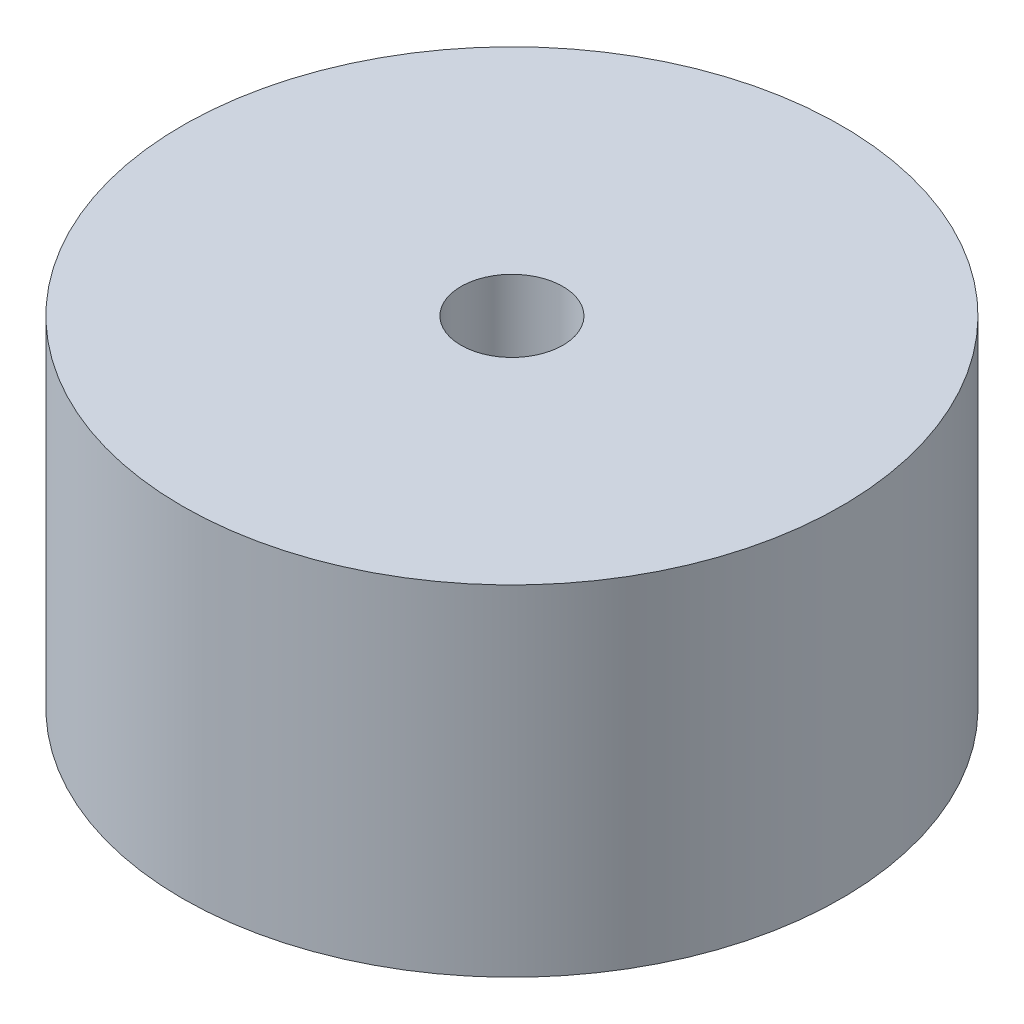
ISO-10303-21;
HEADER;
FILE_DESCRIPTION(('STEP AP214'),'2;1');
FILE_NAME('part.step','',(''),(''),'','','');
FILE_SCHEMA(('AUTOMOTIVE_DESIGN { 1 0 10303 214 1 1 1 1 }'));
ENDSEC;
DATA;
#1=APPLICATION_CONTEXT('core data for automotive mechanical design processes');
#2=APPLICATION_PROTOCOL_DEFINITION('international standard','automotive_design',2000,#1);
#3=PRODUCT_CONTEXT('',#1,'mechanical');
#4=PRODUCT('Part','Part','',(#3));
#5=PRODUCT_RELATED_PRODUCT_CATEGORY('part','',(#4));
#6=PRODUCT_DEFINITION_FORMATION('','',#4);
#7=PRODUCT_DEFINITION_CONTEXT('part definition',#1,'design');
#8=PRODUCT_DEFINITION('design','',#6,#7);
#9=PRODUCT_DEFINITION_SHAPE('','',#8);
#10=(LENGTH_UNIT() NAMED_UNIT(*) SI_UNIT(.MILLI.,.METRE.));
#11=(NAMED_UNIT(*) PLANE_ANGLE_UNIT() SI_UNIT($,.RADIAN.));
#12=(NAMED_UNIT(*) SI_UNIT($,.STERADIAN.) SOLID_ANGLE_UNIT());
#13=UNCERTAINTY_MEASURE_WITH_UNIT(LENGTH_MEASURE(1.E-05),#10,'distance_accuracy_value','');
#14=(GEOMETRIC_REPRESENTATION_CONTEXT(3) GLOBAL_UNCERTAINTY_ASSIGNED_CONTEXT((#13)) GLOBAL_UNIT_ASSIGNED_CONTEXT((#10,
#11,#12)) REPRESENTATION_CONTEXT('',''));
#15=CARTESIAN_POINT('',(0.,0.,0.));
#16=DIRECTION('',(0.,0.,1.));
#17=DIRECTION('',(1.,0.,0.));
#18=AXIS2_PLACEMENT_3D('',#15,#16,#17);
#19=CARTESIAN_POINT('',(0.,50.,0.));
#20=DIRECTION('',(0.,-1.,0.));
#21=DIRECTION('',(0.,0.,-1.));
#22=AXIS2_PLACEMENT_3D('',#19,#20,#21);
#23=CYLINDRICAL_SURFACE('',#22,48.5);
#24=CARTESIAN_POINT('',(0.,50.,0.));
#25=DIRECTION('',(0.,1.,0.));
#26=DIRECTION('',(0.,0.,1.));
#27=AXIS2_PLACEMENT_3D('',#24,#25,#26);
#28=CIRCLE('',#27,48.5);
#29=CARTESIAN_POINT('',(0.,50.,48.5));
#30=VERTEX_POINT('',#29);
#31=EDGE_CURVE('E10',#30,#30,#28,.T.);
#32=ORIENTED_EDGE('',*,*,#31,.F.);
#33=EDGE_LOOP('',(#32));
#34=FACE_BOUND('',#33,.T.);
#35=CARTESIAN_POINT('',(0.,0.,0.));
#36=DIRECTION('',(0.,1.,0.));
#37=DIRECTION('',(0.,0.,1.));
#38=AXIS2_PLACEMENT_3D('',#35,#36,#37);
#39=CIRCLE('',#38,48.5);
#40=CARTESIAN_POINT('',(0.,0.,48.5));
#41=VERTEX_POINT('',#40);
#42=EDGE_CURVE('E37',#41,#41,#39,.T.);
#43=ORIENTED_EDGE('',*,*,#42,.T.);
#44=EDGE_LOOP('',(#43));
#45=FACE_BOUND('',#44,.T.);
#46=ADVANCED_FACE('F40',(#34,#45),#23,.T.);
#47=CARTESIAN_POINT('',(0.,50.,0.));
#48=DIRECTION('',(0.,1.,0.));
#49=DIRECTION('',(0.,0.,1.));
#50=AXIS2_PLACEMENT_3D('',#47,#48,#49);
#51=PLANE('',#50);
#52=CARTESIAN_POINT('',(0.,50.,0.));
#53=DIRECTION('',(0.,1.,0.));
#54=DIRECTION('',(0.,0.,1.));
#55=AXIS2_PLACEMENT_3D('',#52,#53,#54);
#56=CIRCLE('',#55,7.5);
#57=CARTESIAN_POINT('',(0.,50.,7.5));
#58=VERTEX_POINT('',#57);
#59=EDGE_CURVE('E47',#58,#58,#56,.T.);
#60=ORIENTED_EDGE('',*,*,#59,.F.);
#61=EDGE_LOOP('',(#60));
#62=FACE_BOUND('',#61,.T.);
#63=ORIENTED_EDGE('',*,*,#31,.T.);
#64=EDGE_LOOP('',(#63));
#65=FACE_BOUND('',#64,.T.);
#66=ADVANCED_FACE('F62',(#62,#65),#51,.T.);
#67=CARTESIAN_POINT('',(0.,0.,0.));
#68=DIRECTION('',(0.,1.,0.));
#69=DIRECTION('',(0.,0.,1.));
#70=AXIS2_PLACEMENT_3D('',#67,#68,#69);
#71=PLANE('',#70);
#72=ORIENTED_EDGE('',*,*,#42,.F.);
#73=EDGE_LOOP('',(#72));
#74=FACE_BOUND('',#73,.T.);
#75=ADVANCED_FACE('F58',(#74),#71,.F.);
#76=CARTESIAN_POINT('',(0.,20.,0.));
#77=DIRECTION('',(0.,1.,0.));
#78=DIRECTION('',(0.,0.,1.));
#79=AXIS2_PLACEMENT_3D('',#76,#77,#78);
#80=CYLINDRICAL_SURFACE('',#79,7.5);
#81=CARTESIAN_POINT('',(0.,20.,0.));
#82=DIRECTION('',(0.,1.,0.));
#83=DIRECTION('',(0.,0.,1.));
#84=AXIS2_PLACEMENT_3D('',#81,#82,#83);
#85=CIRCLE('',#84,7.5);
#86=CARTESIAN_POINT('',(0.,20.,7.5));
#87=VERTEX_POINT('',#86);
#88=EDGE_CURVE('E50',#87,#87,#85,.T.);
#89=ORIENTED_EDGE('',*,*,#88,.F.);
#90=EDGE_LOOP('',(#89));
#91=FACE_BOUND('',#90,.T.);
#92=ORIENTED_EDGE('',*,*,#59,.T.);
#93=EDGE_LOOP('',(#92));
#94=FACE_BOUND('',#93,.T.);
#95=ADVANCED_FACE('F60',(#91,#94),#80,.F.);
#96=CARTESIAN_POINT('',(0.,20.,0.));
#97=DIRECTION('',(0.,1.,0.));
#98=DIRECTION('',(0.,0.,1.));
#99=AXIS2_PLACEMENT_3D('',#96,#97,#98);
#100=PLANE('',#99);
#101=ORIENTED_EDGE('',*,*,#88,.T.);
#102=EDGE_LOOP('',(#101));
#103=FACE_BOUND('',#102,.T.);
#104=ADVANCED_FACE('F54',(#103),#100,.T.);
#105=CLOSED_SHELL('',(#46,#66,#75,#95,#104));
#106=MANIFOLD_SOLID_BREP('B2',#105);
#107=ADVANCED_BREP_SHAPE_REPRESENTATION('',(#18,#106),#14);
#108=SHAPE_DEFINITION_REPRESENTATION(#9,#107);
ENDSEC;
END-ISO-10303-21;
